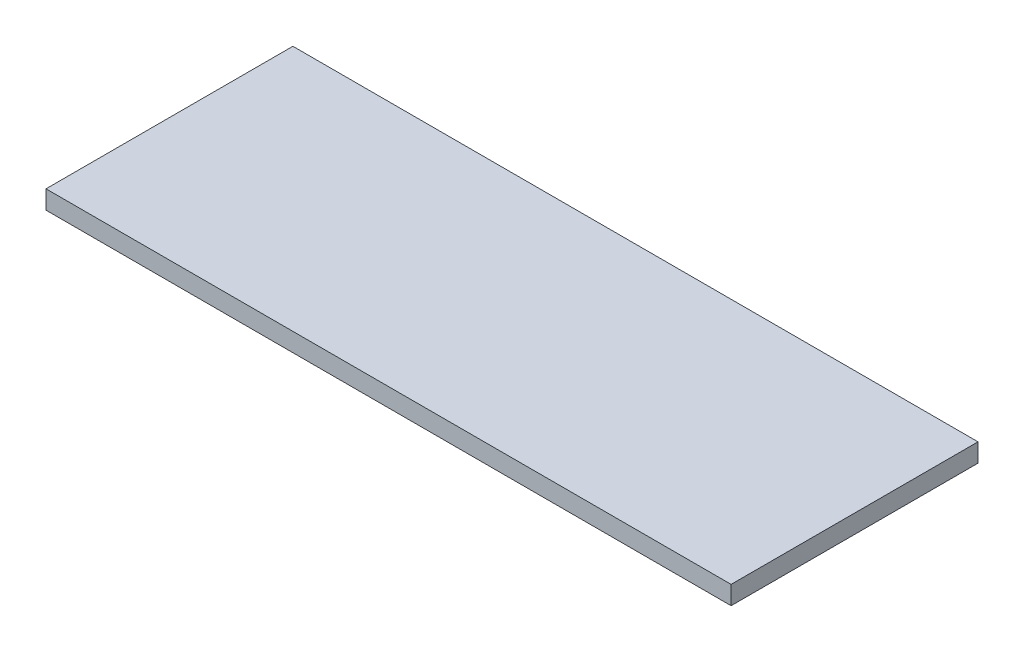
ISO-10303-21;
HEADER;
FILE_DESCRIPTION(('STEP AP214'),'2;1');
FILE_NAME('part.step','',(''),(''),'','','');
FILE_SCHEMA(('AUTOMOTIVE_DESIGN { 1 0 10303 214 1 1 1 1 }'));
ENDSEC;
DATA;
#1=APPLICATION_CONTEXT('core data for automotive mechanical design processes');
#2=APPLICATION_PROTOCOL_DEFINITION('international standard','automotive_design',2000,#1);
#3=PRODUCT_CONTEXT('',#1,'mechanical');
#4=PRODUCT('Part','Part','',(#3));
#5=PRODUCT_RELATED_PRODUCT_CATEGORY('part','',(#4));
#6=PRODUCT_DEFINITION_FORMATION('','',#4);
#7=PRODUCT_DEFINITION_CONTEXT('part definition',#1,'design');
#8=PRODUCT_DEFINITION('design','',#6,#7);
#9=PRODUCT_DEFINITION_SHAPE('','',#8);
#10=(LENGTH_UNIT() NAMED_UNIT(*) SI_UNIT(.MILLI.,.METRE.));
#11=(NAMED_UNIT(*) PLANE_ANGLE_UNIT() SI_UNIT($,.RADIAN.));
#12=(NAMED_UNIT(*) SI_UNIT($,.STERADIAN.) SOLID_ANGLE_UNIT());
#13=UNCERTAINTY_MEASURE_WITH_UNIT(LENGTH_MEASURE(1.E-05),#10,'distance_accuracy_value','');
#14=(GEOMETRIC_REPRESENTATION_CONTEXT(3) GLOBAL_UNCERTAINTY_ASSIGNED_CONTEXT((#13)) GLOBAL_UNIT_ASSIGNED_CONTEXT((#10,
#11,#12)) REPRESENTATION_CONTEXT('',''));
#15=CARTESIAN_POINT('',(0.,0.,0.));
#16=DIRECTION('',(0.,0.,1.));
#17=DIRECTION('',(1.,0.,0.));
#18=AXIS2_PLACEMENT_3D('',#15,#16,#17);
#19=CARTESIAN_POINT('',(88.,-1.5,40.));
#20=DIRECTION('',(1.,0.,0.));
#21=DIRECTION('',(0.,0.,-1.));
#22=AXIS2_PLACEMENT_3D('',#19,#20,#21);
#23=PLANE('',#22);
#24=DIRECTION('',(0.,-1.,0.));
#25=VECTOR('',#24,1.);
#26=CARTESIAN_POINT('',(88.,-1.5,0.));
#27=LINE('',#26,#25);
#28=CARTESIAN_POINT('',(88.,1.5,0.));
#29=VERTEX_POINT('',#28);
#30=CARTESIAN_POINT('',(88.,-1.5,0.));
#31=VERTEX_POINT('',#30);
#32=EDGE_CURVE('E102',#29,#31,#27,.T.);
#33=ORIENTED_EDGE('',*,*,#32,.T.);
#34=DIRECTION('',(0.,0.,-1.));
#35=VECTOR('',#34,1.);
#36=CARTESIAN_POINT('',(88.,-1.5,40.));
#37=LINE('',#36,#35);
#38=CARTESIAN_POINT('',(88.,-1.5,40.));
#39=VERTEX_POINT('',#38);
#40=EDGE_CURVE('E11',#39,#31,#37,.T.);
#41=ORIENTED_EDGE('',*,*,#40,.F.);
#42=DIRECTION('',(0.,-1.,0.));
#43=VECTOR('',#42,1.);
#44=CARTESIAN_POINT('',(88.,-1.5,40.));
#45=LINE('',#44,#43);
#46=CARTESIAN_POINT('',(88.,1.5,40.));
#47=VERTEX_POINT('',#46);
#48=EDGE_CURVE('E90',#47,#39,#45,.T.);
#49=ORIENTED_EDGE('',*,*,#48,.F.);
#50=DIRECTION('',(0.,0.,-1.));
#51=VECTOR('',#50,1.);
#52=CARTESIAN_POINT('',(88.,1.5,40.));
#53=LINE('',#52,#51);
#54=EDGE_CURVE('E98',#47,#29,#53,.T.);
#55=ORIENTED_EDGE('',*,*,#54,.T.);
#56=EDGE_LOOP('',(#33,#41,#49,#55));
#57=FACE_BOUND('',#56,.T.);
#58=ADVANCED_FACE('F39',(#57),#23,.F.);
#59=CARTESIAN_POINT('',(88.,-1.5,40.));
#60=DIRECTION('',(0.,1.,0.));
#61=DIRECTION('',(0.,0.,1.));
#62=AXIS2_PLACEMENT_3D('',#59,#60,#61);
#63=PLANE('',#62);
#64=DIRECTION('',(1.,0.,0.));
#65=VECTOR('',#64,1.);
#66=CARTESIAN_POINT('',(88.,-1.5,0.));
#67=LINE('',#66,#65);
#68=CARTESIAN_POINT('',(199.,-1.5,0.));
#69=VERTEX_POINT('',#68);
#70=EDGE_CURVE('E94',#31,#69,#67,.T.);
#71=ORIENTED_EDGE('',*,*,#70,.T.);
#72=DIRECTION('',(0.,0.,-1.));
#73=VECTOR('',#72,1.);
#74=CARTESIAN_POINT('',(199.,-1.5,40.));
#75=LINE('',#74,#73);
#76=CARTESIAN_POINT('',(199.,-1.5,40.));
#77=VERTEX_POINT('',#76);
#78=EDGE_CURVE('E47',#77,#69,#75,.T.);
#79=ORIENTED_EDGE('',*,*,#78,.F.);
#80=DIRECTION('',(1.,0.,0.));
#81=VECTOR('',#80,1.);
#82=CARTESIAN_POINT('',(88.,-1.5,40.));
#83=LINE('',#82,#81);
#84=EDGE_CURVE('E85',#39,#77,#83,.T.);
#85=ORIENTED_EDGE('',*,*,#84,.F.);
#86=ORIENTED_EDGE('',*,*,#40,.T.);
#87=EDGE_LOOP('',(#71,#79,#85,#86));
#88=FACE_BOUND('',#87,.T.);
#89=ADVANCED_FACE('F93',(#88),#63,.F.);
#90=CARTESIAN_POINT('',(199.,-1.5,40.));
#91=DIRECTION('',(-1.,0.,0.));
#92=DIRECTION('',(0.,0.,1.));
#93=AXIS2_PLACEMENT_3D('',#90,#91,#92);
#94=PLANE('',#93);
#95=DIRECTION('',(0.,1.,0.));
#96=VECTOR('',#95,1.);
#97=CARTESIAN_POINT('',(199.,-1.5,0.));
#98=LINE('',#97,#96);
#99=CARTESIAN_POINT('',(199.,1.5,0.));
#100=VERTEX_POINT('',#99);
#101=EDGE_CURVE('E72',#69,#100,#98,.T.);
#102=ORIENTED_EDGE('',*,*,#101,.T.);
#103=DIRECTION('',(0.,0.,-1.));
#104=VECTOR('',#103,1.);
#105=CARTESIAN_POINT('',(199.,1.5,40.));
#106=LINE('',#105,#104);
#107=CARTESIAN_POINT('',(199.,1.5,40.));
#108=VERTEX_POINT('',#107);
#109=EDGE_CURVE('E95',#108,#100,#106,.T.);
#110=ORIENTED_EDGE('',*,*,#109,.F.);
#111=DIRECTION('',(0.,1.,0.));
#112=VECTOR('',#111,1.);
#113=CARTESIAN_POINT('',(199.,-1.5,40.));
#114=LINE('',#113,#112);
#115=EDGE_CURVE('E88',#77,#108,#114,.T.);
#116=ORIENTED_EDGE('',*,*,#115,.F.);
#117=ORIENTED_EDGE('',*,*,#78,.T.);
#118=EDGE_LOOP('',(#102,#110,#116,#117));
#119=FACE_BOUND('',#118,.T.);
#120=ADVANCED_FACE('F96',(#119),#94,.F.);
#121=CARTESIAN_POINT('',(88.,1.5,40.));
#122=DIRECTION('',(0.,-1.,0.));
#123=DIRECTION('',(0.,0.,-1.));
#124=AXIS2_PLACEMENT_3D('',#121,#122,#123);
#125=PLANE('',#124);
#126=DIRECTION('',(-1.,0.,0.));
#127=VECTOR('',#126,1.);
#128=CARTESIAN_POINT('',(88.,1.5,0.));
#129=LINE('',#128,#127);
#130=EDGE_CURVE('E78',#100,#29,#129,.T.);
#131=ORIENTED_EDGE('',*,*,#130,.T.);
#132=ORIENTED_EDGE('',*,*,#54,.F.);
#133=DIRECTION('',(-1.,0.,0.));
#134=VECTOR('',#133,1.);
#135=CARTESIAN_POINT('',(88.,1.5,40.));
#136=LINE('',#135,#134);
#137=EDGE_CURVE('E55',#108,#47,#136,.T.);
#138=ORIENTED_EDGE('',*,*,#137,.F.);
#139=ORIENTED_EDGE('',*,*,#109,.T.);
#140=EDGE_LOOP('',(#131,#132,#138,#139));
#141=FACE_BOUND('',#140,.T.);
#142=ADVANCED_FACE('F109',(#141),#125,.F.);
#143=CARTESIAN_POINT('',(0.,0.,40.));
#144=DIRECTION('',(0.,0.,-1.));
#145=DIRECTION('',(-1.,0.,0.));
#146=AXIS2_PLACEMENT_3D('',#143,#144,#145);
#147=PLANE('',#146);
#148=ORIENTED_EDGE('',*,*,#48,.T.);
#149=ORIENTED_EDGE('',*,*,#84,.T.);
#150=ORIENTED_EDGE('',*,*,#115,.T.);
#151=ORIENTED_EDGE('',*,*,#137,.T.);
#152=EDGE_LOOP('',(#148,#149,#150,#151));
#153=FACE_BOUND('',#152,.T.);
#154=ADVANCED_FACE('F86',(#153),#147,.F.);
#155=CARTESIAN_POINT('',(0.,0.,0.));
#156=DIRECTION('',(0.,0.,-1.));
#157=DIRECTION('',(-1.,0.,0.));
#158=AXIS2_PLACEMENT_3D('',#155,#156,#157);
#159=PLANE('',#158);
#160=ORIENTED_EDGE('',*,*,#32,.F.);
#161=ORIENTED_EDGE('',*,*,#130,.F.);
#162=ORIENTED_EDGE('',*,*,#101,.F.);
#163=ORIENTED_EDGE('',*,*,#70,.F.);
#164=EDGE_LOOP('',(#160,#161,#162,#163));
#165=FACE_BOUND('',#164,.T.);
#166=ADVANCED_FACE('F112',(#165),#159,.T.);
#167=CLOSED_SHELL('',(#58,#89,#120,#142,#154,#166));
#168=MANIFOLD_SOLID_BREP('B2',#167);
#169=ADVANCED_BREP_SHAPE_REPRESENTATION('',(#18,#168),#14);
#170=SHAPE_DEFINITION_REPRESENTATION(#9,#169);
ENDSEC;
END-ISO-10303-21;
